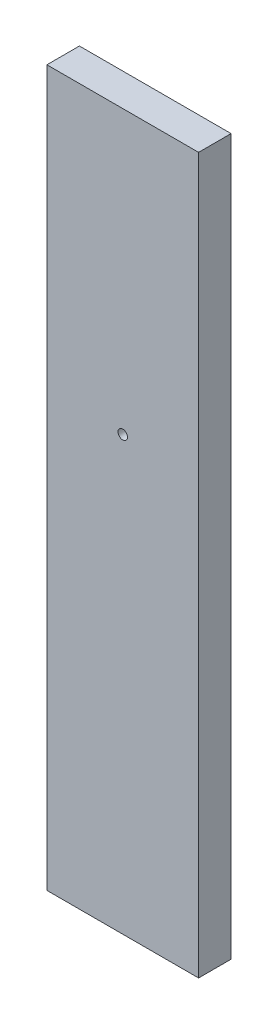
ISO-10303-21;
HEADER;
FILE_DESCRIPTION(('STEP AP214'),'2;1');
FILE_NAME('part.step','',(''),(''),'','','');
FILE_SCHEMA(('AUTOMOTIVE_DESIGN { 1 0 10303 214 1 1 1 1 }'));
ENDSEC;
DATA;
#1=APPLICATION_CONTEXT('core data for automotive mechanical design processes');
#2=APPLICATION_PROTOCOL_DEFINITION('international standard','automotive_design',2000,#1);
#3=PRODUCT_CONTEXT('',#1,'mechanical');
#4=PRODUCT('Part','Part','',(#3));
#5=PRODUCT_RELATED_PRODUCT_CATEGORY('part','',(#4));
#6=PRODUCT_DEFINITION_FORMATION('','',#4);
#7=PRODUCT_DEFINITION_CONTEXT('part definition',#1,'design');
#8=PRODUCT_DEFINITION('design','',#6,#7);
#9=PRODUCT_DEFINITION_SHAPE('','',#8);
#10=(LENGTH_UNIT() NAMED_UNIT(*) SI_UNIT(.MILLI.,.METRE.));
#11=(NAMED_UNIT(*) PLANE_ANGLE_UNIT() SI_UNIT($,.RADIAN.));
#12=(NAMED_UNIT(*) SI_UNIT($,.STERADIAN.) SOLID_ANGLE_UNIT());
#13=UNCERTAINTY_MEASURE_WITH_UNIT(LENGTH_MEASURE(1.E-05),#10,'distance_accuracy_value','');
#14=(GEOMETRIC_REPRESENTATION_CONTEXT(3) GLOBAL_UNCERTAINTY_ASSIGNED_CONTEXT((#13)) GLOBAL_UNIT_ASSIGNED_CONTEXT((#10,
#11,#12)) REPRESENTATION_CONTEXT('',''));
#15=CARTESIAN_POINT('',(0.,0.,0.));
#16=DIRECTION('',(0.,0.,1.));
#17=DIRECTION('',(1.,0.,0.));
#18=AXIS2_PLACEMENT_3D('',#15,#16,#17);
#19=CARTESIAN_POINT('',(0.,419.1,0.));
#20=DIRECTION('',(1.,0.,0.));
#21=DIRECTION('',(0.,0.,-1.));
#22=AXIS2_PLACEMENT_3D('',#19,#20,#21);
#23=PLANE('',#22);
#24=DIRECTION('',(0.,0.,1.));
#25=VECTOR('',#24,1.);
#26=CARTESIAN_POINT('',(0.,0.,0.));
#27=LINE('',#26,#25);
#28=CARTESIAN_POINT('',(0.,0.,-19.05));
#29=VERTEX_POINT('',#28);
#30=CARTESIAN_POINT('',(0.,0.,0.));
#31=VERTEX_POINT('',#30);
#32=EDGE_CURVE('E102',#29,#31,#27,.T.);
#33=ORIENTED_EDGE('',*,*,#32,.T.);
#34=DIRECTION('',(0.,-1.,0.));
#35=VECTOR('',#34,1.);
#36=CARTESIAN_POINT('',(0.,419.1,0.));
#37=LINE('',#36,#35);
#38=CARTESIAN_POINT('',(0.,419.1,0.));
#39=VERTEX_POINT('',#38);
#40=EDGE_CURVE('E11',#39,#31,#37,.T.);
#41=ORIENTED_EDGE('',*,*,#40,.F.);
#42=DIRECTION('',(0.,0.,1.));
#43=VECTOR('',#42,1.);
#44=CARTESIAN_POINT('',(0.,419.1,0.));
#45=LINE('',#44,#43);
#46=CARTESIAN_POINT('',(0.,419.1,-19.05));
#47=VERTEX_POINT('',#46);
#48=EDGE_CURVE('E90',#47,#39,#45,.T.);
#49=ORIENTED_EDGE('',*,*,#48,.F.);
#50=DIRECTION('',(0.,-1.,0.));
#51=VECTOR('',#50,1.);
#52=CARTESIAN_POINT('',(0.,419.1,-19.05));
#53=LINE('',#52,#51);
#54=EDGE_CURVE('E98',#47,#29,#53,.T.);
#55=ORIENTED_EDGE('',*,*,#54,.T.);
#56=EDGE_LOOP('',(#33,#41,#49,#55));
#57=FACE_BOUND('',#56,.T.);
#58=ADVANCED_FACE('F39',(#57),#23,.F.);
#59=CARTESIAN_POINT('',(0.,419.1,0.));
#60=DIRECTION('',(0.,0.,-1.));
#61=DIRECTION('',(-1.,0.,0.));
#62=AXIS2_PLACEMENT_3D('',#59,#60,#61);
#63=PLANE('',#62);
#64=CARTESIAN_POINT('',(44.45,253.651766,0.));
#65=DIRECTION('',(0.,0.,1.));
#66=DIRECTION('',(1.,0.,0.));
#67=AXIS2_PLACEMENT_3D('',#64,#65,#66);
#68=CIRCLE('',#67,2.77812500000002);
#69=CARTESIAN_POINT('',(47.228125,253.651766,0.));
#70=VERTEX_POINT('',#69);
#71=EDGE_CURVE('E116',#70,#70,#68,.T.);
#72=ORIENTED_EDGE('',*,*,#71,.F.);
#73=EDGE_LOOP('',(#72));
#74=FACE_BOUND('',#73,.T.);
#75=DIRECTION('',(1.,0.,0.));
#76=VECTOR('',#75,1.);
#77=CARTESIAN_POINT('',(0.,0.,0.));
#78=LINE('',#77,#76);
#79=CARTESIAN_POINT('',(88.9,0.,0.));
#80=VERTEX_POINT('',#79);
#81=EDGE_CURVE('E94',#31,#80,#78,.T.);
#82=ORIENTED_EDGE('',*,*,#81,.T.);
#83=DIRECTION('',(0.,-1.,0.));
#84=VECTOR('',#83,1.);
#85=CARTESIAN_POINT('',(88.9,419.1,0.));
#86=LINE('',#85,#84);
#87=CARTESIAN_POINT('',(88.9,419.1,0.));
#88=VERTEX_POINT('',#87);
#89=EDGE_CURVE('E47',#88,#80,#86,.T.);
#90=ORIENTED_EDGE('',*,*,#89,.F.);
#91=DIRECTION('',(1.,0.,0.));
#92=VECTOR('',#91,1.);
#93=CARTESIAN_POINT('',(0.,419.1,0.));
#94=LINE('',#93,#92);
#95=EDGE_CURVE('E85',#39,#88,#94,.T.);
#96=ORIENTED_EDGE('',*,*,#95,.F.);
#97=ORIENTED_EDGE('',*,*,#40,.T.);
#98=EDGE_LOOP('',(#82,#90,#96,#97));
#99=FACE_BOUND('',#98,.T.);
#100=ADVANCED_FACE('F93',(#74,#99),#63,.F.);
#101=CARTESIAN_POINT('',(88.9,419.1,0.));
#102=DIRECTION('',(-1.,0.,0.));
#103=DIRECTION('',(0.,0.,1.));
#104=AXIS2_PLACEMENT_3D('',#101,#102,#103);
#105=PLANE('',#104);
#106=DIRECTION('',(0.,0.,-1.));
#107=VECTOR('',#106,1.);
#108=CARTESIAN_POINT('',(88.9,0.,0.));
#109=LINE('',#108,#107);
#110=CARTESIAN_POINT('',(88.9,0.,-19.05));
#111=VERTEX_POINT('',#110);
#112=EDGE_CURVE('E72',#80,#111,#109,.T.);
#113=ORIENTED_EDGE('',*,*,#112,.T.);
#114=DIRECTION('',(0.,-1.,0.));
#115=VECTOR('',#114,1.);
#116=CARTESIAN_POINT('',(88.9,419.1,-19.05));
#117=LINE('',#116,#115);
#118=CARTESIAN_POINT('',(88.9,419.1,-19.05));
#119=VERTEX_POINT('',#118);
#120=EDGE_CURVE('E95',#119,#111,#117,.T.);
#121=ORIENTED_EDGE('',*,*,#120,.F.);
#122=DIRECTION('',(0.,0.,-1.));
#123=VECTOR('',#122,1.);
#124=CARTESIAN_POINT('',(88.9,419.1,0.));
#125=LINE('',#124,#123);
#126=EDGE_CURVE('E88',#88,#119,#125,.T.);
#127=ORIENTED_EDGE('',*,*,#126,.F.);
#128=ORIENTED_EDGE('',*,*,#89,.T.);
#129=EDGE_LOOP('',(#113,#121,#127,#128));
#130=FACE_BOUND('',#129,.T.);
#131=ADVANCED_FACE('F96',(#130),#105,.F.);
#132=CARTESIAN_POINT('',(0.,419.1,-19.05));
#133=DIRECTION('',(0.,0.,1.));
#134=DIRECTION('',(1.,0.,0.));
#135=AXIS2_PLACEMENT_3D('',#132,#133,#134);
#136=PLANE('',#135);
#137=CARTESIAN_POINT('',(44.45,253.651766,-19.05));
#138=DIRECTION('',(0.,0.,1.));
#139=DIRECTION('',(1.,0.,0.));
#140=AXIS2_PLACEMENT_3D('',#137,#138,#139);
#141=CIRCLE('',#140,2.77812500000002);
#142=CARTESIAN_POINT('',(47.228125,253.651766,-19.05));
#143=VERTEX_POINT('',#142);
#144=EDGE_CURVE('E105',#143,#143,#141,.T.);
#145=ORIENTED_EDGE('',*,*,#144,.T.);
#146=EDGE_LOOP('',(#145));
#147=FACE_BOUND('',#146,.T.);
#148=DIRECTION('',(-1.,0.,0.));
#149=VECTOR('',#148,1.);
#150=CARTESIAN_POINT('',(0.,0.,-19.05));
#151=LINE('',#150,#149);
#152=EDGE_CURVE('E78',#111,#29,#151,.T.);
#153=ORIENTED_EDGE('',*,*,#152,.T.);
#154=ORIENTED_EDGE('',*,*,#54,.F.);
#155=DIRECTION('',(-1.,0.,0.));
#156=VECTOR('',#155,1.);
#157=CARTESIAN_POINT('',(0.,419.1,-19.05));
#158=LINE('',#157,#156);
#159=EDGE_CURVE('E55',#119,#47,#158,.T.);
#160=ORIENTED_EDGE('',*,*,#159,.F.);
#161=ORIENTED_EDGE('',*,*,#120,.T.);
#162=EDGE_LOOP('',(#153,#154,#160,#161));
#163=FACE_BOUND('',#162,.T.);
#164=ADVANCED_FACE('F110',(#147,#163),#136,.F.);
#165=CARTESIAN_POINT('',(0.,419.1,0.));
#166=DIRECTION('',(0.,-1.,0.));
#167=DIRECTION('',(0.,0.,-1.));
#168=AXIS2_PLACEMENT_3D('',#165,#166,#167);
#169=PLANE('',#168);
#170=ORIENTED_EDGE('',*,*,#48,.T.);
#171=ORIENTED_EDGE('',*,*,#95,.T.);
#172=ORIENTED_EDGE('',*,*,#126,.T.);
#173=ORIENTED_EDGE('',*,*,#159,.T.);
#174=EDGE_LOOP('',(#170,#171,#172,#173));
#175=FACE_BOUND('',#174,.T.);
#176=ADVANCED_FACE('F86',(#175),#169,.F.);
#177=CARTESIAN_POINT('',(0.,0.,0.));
#178=DIRECTION('',(0.,-1.,0.));
#179=DIRECTION('',(0.,0.,-1.));
#180=AXIS2_PLACEMENT_3D('',#177,#178,#179);
#181=PLANE('',#180);
#182=ORIENTED_EDGE('',*,*,#32,.F.);
#183=ORIENTED_EDGE('',*,*,#152,.F.);
#184=ORIENTED_EDGE('',*,*,#112,.F.);
#185=ORIENTED_EDGE('',*,*,#81,.F.);
#186=EDGE_LOOP('',(#182,#183,#184,#185));
#187=FACE_BOUND('',#186,.T.);
#188=ADVANCED_FACE('F113',(#187),#181,.T.);
#189=CARTESIAN_POINT('',(44.45,253.651766,-19.05));
#190=DIRECTION('',(0.,0.,1.));
#191=DIRECTION('',(1.,0.,0.));
#192=AXIS2_PLACEMENT_3D('',#189,#190,#191);
#193=CYLINDRICAL_SURFACE('',#192,2.77812500000002);
#194=CARTESIAN_POINT('',(47.228125,253.651766,-19.05));
#195=CARTESIAN_POINT('',(47.228125,253.651766,-18.8515625));
#196=CARTESIAN_POINT('',(47.228125,253.651766,-18.653125));
#197=CARTESIAN_POINT('',(47.228125,253.651766,-18.25625));
#198=CARTESIAN_POINT('',(47.228125,253.651766,-18.0578125));
#199=CARTESIAN_POINT('',(47.228125,253.651766,-17.6609375));
#200=CARTESIAN_POINT('',(47.228125,253.651766,-17.4625));
#201=CARTESIAN_POINT('',(47.228125,253.651766,-17.065625));
#202=CARTESIAN_POINT('',(47.228125,253.651766,-16.8671875));
#203=CARTESIAN_POINT('',(47.228125,253.651766,-16.4703125));
#204=CARTESIAN_POINT('',(47.228125,253.651766,-16.271875));
#205=CARTESIAN_POINT('',(47.228125,253.651766,-15.875));
#206=CARTESIAN_POINT('',(47.228125,253.651766,-15.6765625));
#207=CARTESIAN_POINT('',(47.228125,253.651766,-15.2796875));
#208=CARTESIAN_POINT('',(47.228125,253.651766,-15.08125));
#209=CARTESIAN_POINT('',(47.228125,253.651766,-14.684375));
#210=CARTESIAN_POINT('',(47.228125,253.651766,-14.4859375));
#211=CARTESIAN_POINT('',(47.228125,253.651766,-14.0890625));
#212=CARTESIAN_POINT('',(47.228125,253.651766,-13.890625));
#213=CARTESIAN_POINT('',(47.228125,253.651766,-13.49375));
#214=CARTESIAN_POINT('',(47.228125,253.651766,-13.2953125));
#215=CARTESIAN_POINT('',(47.228125,253.651766,-12.8984375));
#216=CARTESIAN_POINT('',(47.228125,253.651766,-12.7));
#217=CARTESIAN_POINT('',(47.228125,253.651766,-12.303125));
#218=CARTESIAN_POINT('',(47.228125,253.651766,-12.1046875));
#219=CARTESIAN_POINT('',(47.228125,253.651766,-11.7078125));
#220=CARTESIAN_POINT('',(47.228125,253.651766,-11.509375));
#221=CARTESIAN_POINT('',(47.228125,253.651766,-11.1125));
#222=CARTESIAN_POINT('',(47.228125,253.651766,-10.9140625));
#223=CARTESIAN_POINT('',(47.228125,253.651766,-10.5171875));
#224=CARTESIAN_POINT('',(47.228125,253.651766,-10.31875));
#225=CARTESIAN_POINT('',(47.228125,253.651766,-9.921875));
#226=CARTESIAN_POINT('',(47.228125,253.651766,-9.7234375));
#227=CARTESIAN_POINT('',(47.228125,253.651766,-9.3265625));
#228=CARTESIAN_POINT('',(47.228125,253.651766,-9.128125));
#229=CARTESIAN_POINT('',(47.228125,253.651766,-8.73125));
#230=CARTESIAN_POINT('',(47.228125,253.651766,-8.5328125));
#231=CARTESIAN_POINT('',(47.228125,253.651766,-8.1359375));
#232=CARTESIAN_POINT('',(47.228125,253.651766,-7.9375));
#233=CARTESIAN_POINT('',(47.228125,253.651766,-7.540625));
#234=CARTESIAN_POINT('',(47.228125,253.651766,-7.3421875));
#235=CARTESIAN_POINT('',(47.228125,253.651766,-6.9453125));
#236=CARTESIAN_POINT('',(47.228125,253.651766,-6.746875));
#237=CARTESIAN_POINT('',(47.228125,253.651766,-6.35));
#238=CARTESIAN_POINT('',(47.228125,253.651766,-6.1515625));
#239=CARTESIAN_POINT('',(47.228125,253.651766,-5.7546875));
#240=CARTESIAN_POINT('',(47.228125,253.651766,-5.55625));
#241=CARTESIAN_POINT('',(47.228125,253.651766,-5.159375));
#242=CARTESIAN_POINT('',(47.228125,253.651766,-4.9609375));
#243=CARTESIAN_POINT('',(47.228125,253.651766,-4.5640625));
#244=CARTESIAN_POINT('',(47.228125,253.651766,-4.365625));
#245=CARTESIAN_POINT('',(47.228125,253.651766,-3.96875));
#246=CARTESIAN_POINT('',(47.228125,253.651766,-3.7703125));
#247=CARTESIAN_POINT('',(47.228125,253.651766,-3.3734375));
#248=CARTESIAN_POINT('',(47.228125,253.651766,-3.175));
#249=CARTESIAN_POINT('',(47.228125,253.651766,-2.778125));
#250=CARTESIAN_POINT('',(47.228125,253.651766,-2.5796875));
#251=CARTESIAN_POINT('',(47.228125,253.651766,-2.1828125));
#252=CARTESIAN_POINT('',(47.228125,253.651766,-1.984375));
#253=CARTESIAN_POINT('',(47.228125,253.651766,-1.5875));
#254=CARTESIAN_POINT('',(47.228125,253.651766,-1.3890625));
#255=CARTESIAN_POINT('',(47.228125,253.651766,-0.992187500000001));
#256=CARTESIAN_POINT('',(47.228125,253.651766,-0.793750000000001));
#257=CARTESIAN_POINT('',(47.228125,253.651766,-0.396875));
#258=CARTESIAN_POINT('',(47.228125,253.651766,-0.1984375));
#259=CARTESIAN_POINT('',(47.228125,253.651766,0.));
#260=B_SPLINE_CURVE_WITH_KNOTS('',3,(#194,#195,#196,#197,#198,#199,#200,#201,#202,#203,#204,
#205,#206,#207,#208,#209,#210,#211,#212,#213,#214,#215,#216,#217,#218,#219,#220,#221,#222,#223,
#224,#225,#226,#227,#228,#229,#230,#231,#232,#233,#234,#235,#236,#237,#238,#239,#240,#241,#242,
#243,#244,#245,#246,#247,#248,#249,#250,#251,#252,#253,#254,#255,#256,#257,#258,#259),
.UNSPECIFIED.,.F.,.F.,(4,2,2,2,2,2,2,2,2,2,2,2,2,2,2,2,2,2,2,2,2,2,2,2,2,2,2,2,2,2,2,2,4),(0.,
0.5953125,1.190625,1.7859375,2.38125,2.9765625,3.571875,4.1671875,4.7625,5.3578125,5.953125,
6.5484375,7.14375,7.7390625,8.334375,8.9296875,9.525,10.1203125,10.715625,11.3109375,11.90625,
12.5015625,13.096875,13.6921875,14.2875,14.8828125,15.478125,16.0734375,16.66875,17.2640625,
17.859375,18.4546875,19.05),.UNSPECIFIED.);
#261=EDGE_CURVE('BSEAM123',#143,#70,#260,.T.);
#262=ORIENTED_EDGE('',*,*,#144,.F.);
#263=ORIENTED_EDGE('',*,*,#71,.T.);
#264=ORIENTED_EDGE('',*,*,#261,.T.);
#265=ORIENTED_EDGE('',*,*,#261,.F.);
#266=EDGE_LOOP('',(#262,#264,#263,#265));
#267=FACE_BOUND('',#266,.T.);
#268=ADVANCED_FACE('F123',(#267),#193,.F.);
#269=CLOSED_SHELL('',(#58,#100,#131,#164,#176,#188,#268));
#270=MANIFOLD_SOLID_BREP('B2',#269);
#271=ADVANCED_BREP_SHAPE_REPRESENTATION('',(#18,#270),#14);
#272=SHAPE_DEFINITION_REPRESENTATION(#9,#271);
ENDSEC;
END-ISO-10303-21;
